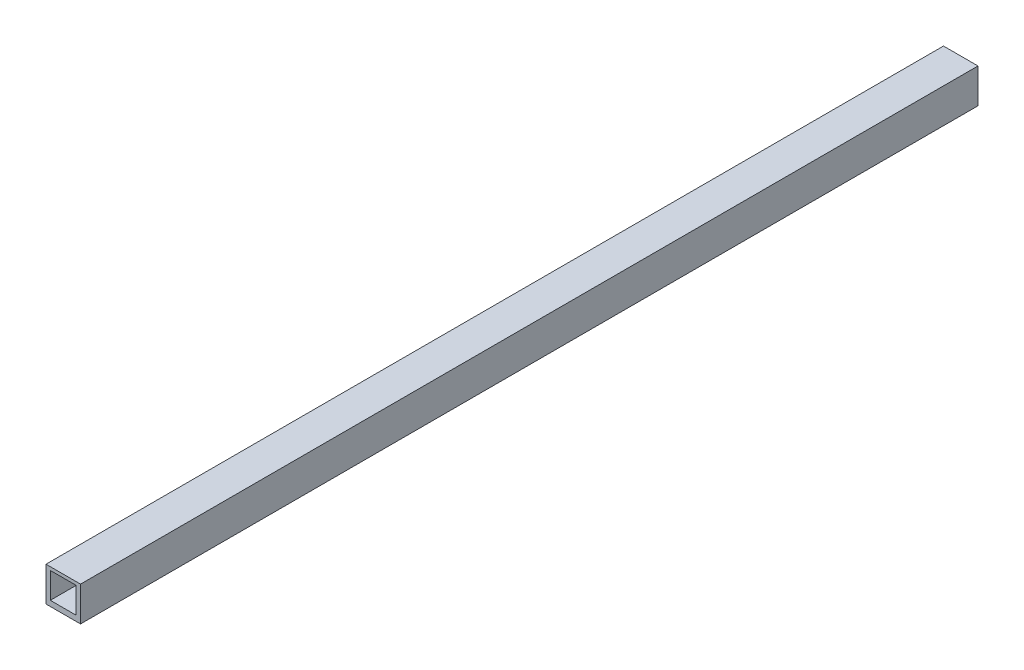
ISO-10303-21;
HEADER;
FILE_DESCRIPTION(('STEP AP214'),'2;1');
FILE_NAME('part.step','',(''),(''),'','','');
FILE_SCHEMA(('AUTOMOTIVE_DESIGN { 1 0 10303 214 1 1 1 1 }'));
ENDSEC;
DATA;
#1=APPLICATION_CONTEXT('core data for automotive mechanical design processes');
#2=APPLICATION_PROTOCOL_DEFINITION('international standard','automotive_design',2000,#1);
#3=PRODUCT_CONTEXT('',#1,'mechanical');
#4=PRODUCT('Part','Part','',(#3));
#5=PRODUCT_RELATED_PRODUCT_CATEGORY('part','',(#4));
#6=PRODUCT_DEFINITION_FORMATION('','',#4);
#7=PRODUCT_DEFINITION_CONTEXT('part definition',#1,'design');
#8=PRODUCT_DEFINITION('design','',#6,#7);
#9=PRODUCT_DEFINITION_SHAPE('','',#8);
#10=(LENGTH_UNIT() NAMED_UNIT(*) SI_UNIT(.MILLI.,.METRE.));
#11=(NAMED_UNIT(*) PLANE_ANGLE_UNIT() SI_UNIT($,.RADIAN.));
#12=(NAMED_UNIT(*) SI_UNIT($,.STERADIAN.) SOLID_ANGLE_UNIT());
#13=UNCERTAINTY_MEASURE_WITH_UNIT(LENGTH_MEASURE(1.E-05),#10,'distance_accuracy_value','');
#14=(GEOMETRIC_REPRESENTATION_CONTEXT(3) GLOBAL_UNCERTAINTY_ASSIGNED_CONTEXT((#13)) GLOBAL_UNIT_ASSIGNED_CONTEXT((#10,
#11,#12)) REPRESENTATION_CONTEXT('',''));
#15=CARTESIAN_POINT('',(0.,0.,0.));
#16=DIRECTION('',(0.,0.,1.));
#17=DIRECTION('',(1.,0.,0.));
#18=AXIS2_PLACEMENT_3D('',#15,#16,#17);
#19=CARTESIAN_POINT('',(12.7,-13.4892655367232,660.4));
#20=DIRECTION('',(-1.,0.,0.));
#21=DIRECTION('',(0.,0.,1.));
#22=AXIS2_PLACEMENT_3D('',#19,#20,#21);
#23=PLANE('',#22);
#24=DIRECTION('',(0.,1.,0.));
#25=VECTOR('',#24,1.);
#26=CARTESIAN_POINT('',(12.7,-13.4892655367232,0.));
#27=LINE('',#26,#25);
#28=CARTESIAN_POINT('',(12.7,-13.4892655367232,0.));
#29=VERTEX_POINT('',#28);
#30=CARTESIAN_POINT('',(12.7,11.9107344632768,0.));
#31=VERTEX_POINT('',#30);
#32=EDGE_CURVE('E156',#29,#31,#27,.T.);
#33=ORIENTED_EDGE('',*,*,#32,.T.);
#34=DIRECTION('',(0.,0.,-1.));
#35=VECTOR('',#34,1.);
#36=CARTESIAN_POINT('',(12.7,11.9107344632768,660.4));
#37=LINE('',#36,#35);
#38=CARTESIAN_POINT('',(12.7,11.9107344632768,660.4));
#39=VERTEX_POINT('',#38);
#40=EDGE_CURVE('E11',#39,#31,#37,.T.);
#41=ORIENTED_EDGE('',*,*,#40,.F.);
#42=DIRECTION('',(0.,1.,0.));
#43=VECTOR('',#42,1.);
#44=CARTESIAN_POINT('',(12.7,-13.4892655367232,660.4));
#45=LINE('',#44,#43);
#46=CARTESIAN_POINT('',(12.7,-13.4892655367232,660.4));
#47=VERTEX_POINT('',#46);
#48=EDGE_CURVE('E157',#47,#39,#45,.T.);
#49=ORIENTED_EDGE('',*,*,#48,.F.);
#50=DIRECTION('',(0.,0.,-1.));
#51=VECTOR('',#50,1.);
#52=CARTESIAN_POINT('',(12.7,-13.4892655367232,660.4));
#53=LINE('',#52,#51);
#54=EDGE_CURVE('E171',#47,#29,#53,.T.);
#55=ORIENTED_EDGE('',*,*,#54,.T.);
#56=EDGE_LOOP('',(#33,#41,#49,#55));
#57=FACE_BOUND('',#56,.T.);
#58=ADVANCED_FACE('F45',(#57),#23,.F.);
#59=CARTESIAN_POINT('',(-12.7,11.9107344632768,660.4));
#60=DIRECTION('',(0.,-1.,0.));
#61=DIRECTION('',(0.,0.,-1.));
#62=AXIS2_PLACEMENT_3D('',#59,#60,#61);
#63=PLANE('',#62);
#64=DIRECTION('',(-1.,0.,0.));
#65=VECTOR('',#64,1.);
#66=CARTESIAN_POINT('',(-12.7,11.9107344632768,0.));
#67=LINE('',#66,#65);
#68=CARTESIAN_POINT('',(-12.7,11.9107344632768,0.));
#69=VERTEX_POINT('',#68);
#70=EDGE_CURVE('E175',#31,#69,#67,.T.);
#71=ORIENTED_EDGE('',*,*,#70,.T.);
#72=DIRECTION('',(0.,0.,-1.));
#73=VECTOR('',#72,1.);
#74=CARTESIAN_POINT('',(-12.7,11.9107344632768,660.4));
#75=LINE('',#74,#73);
#76=CARTESIAN_POINT('',(-12.7,11.9107344632768,660.4));
#77=VERTEX_POINT('',#76);
#78=EDGE_CURVE('E53',#77,#69,#75,.T.);
#79=ORIENTED_EDGE('',*,*,#78,.F.);
#80=DIRECTION('',(-1.,0.,0.));
#81=VECTOR('',#80,1.);
#82=CARTESIAN_POINT('',(-12.7,11.9107344632768,660.4));
#83=LINE('',#82,#81);
#84=EDGE_CURVE('E161',#39,#77,#83,.T.);
#85=ORIENTED_EDGE('',*,*,#84,.F.);
#86=ORIENTED_EDGE('',*,*,#40,.T.);
#87=EDGE_LOOP('',(#71,#79,#85,#86));
#88=FACE_BOUND('',#87,.T.);
#89=ADVANCED_FACE('F209',(#88),#63,.F.);
#90=CARTESIAN_POINT('',(-12.7,-13.4892655367232,660.4));
#91=DIRECTION('',(1.,0.,0.));
#92=DIRECTION('',(0.,0.,-1.));
#93=AXIS2_PLACEMENT_3D('',#90,#91,#92);
#94=PLANE('',#93);
#95=DIRECTION('',(0.,-1.,0.));
#96=VECTOR('',#95,1.);
#97=CARTESIAN_POINT('',(-12.7,-13.4892655367232,0.));
#98=LINE('',#97,#96);
#99=CARTESIAN_POINT('',(-12.7,-13.4892655367232,0.));
#100=VERTEX_POINT('',#99);
#101=EDGE_CURVE('E178',#69,#100,#98,.T.);
#102=ORIENTED_EDGE('',*,*,#101,.T.);
#103=DIRECTION('',(0.,0.,-1.));
#104=VECTOR('',#103,1.);
#105=CARTESIAN_POINT('',(-12.7,-13.4892655367232,660.4));
#106=LINE('',#105,#104);
#107=CARTESIAN_POINT('',(-12.7,-13.4892655367232,660.4));
#108=VERTEX_POINT('',#107);
#109=EDGE_CURVE('E186',#108,#100,#106,.T.);
#110=ORIENTED_EDGE('',*,*,#109,.F.);
#111=DIRECTION('',(0.,-1.,0.));
#112=VECTOR('',#111,1.);
#113=CARTESIAN_POINT('',(-12.7,-13.4892655367232,660.4));
#114=LINE('',#113,#112);
#115=EDGE_CURVE('E165',#77,#108,#114,.T.);
#116=ORIENTED_EDGE('',*,*,#115,.F.);
#117=ORIENTED_EDGE('',*,*,#78,.T.);
#118=EDGE_LOOP('',(#102,#110,#116,#117));
#119=FACE_BOUND('',#118,.T.);
#120=ADVANCED_FACE('F195',(#119),#94,.F.);
#121=CARTESIAN_POINT('',(-12.7,-13.4892655367232,660.4));
#122=DIRECTION('',(0.,1.,0.));
#123=DIRECTION('',(0.,0.,1.));
#124=AXIS2_PLACEMENT_3D('',#121,#122,#123);
#125=PLANE('',#124);
#126=DIRECTION('',(1.,0.,0.));
#127=VECTOR('',#126,1.);
#128=CARTESIAN_POINT('',(-12.7,-13.4892655367232,0.));
#129=LINE('',#128,#127);
#130=EDGE_CURVE('E162',#100,#29,#129,.T.);
#131=ORIENTED_EDGE('',*,*,#130,.T.);
#132=ORIENTED_EDGE('',*,*,#54,.F.);
#133=DIRECTION('',(1.,0.,0.));
#134=VECTOR('',#133,1.);
#135=CARTESIAN_POINT('',(-12.7,-13.4892655367232,660.4));
#136=LINE('',#135,#134);
#137=EDGE_CURVE('E168',#108,#47,#136,.T.);
#138=ORIENTED_EDGE('',*,*,#137,.F.);
#139=ORIENTED_EDGE('',*,*,#109,.T.);
#140=EDGE_LOOP('',(#131,#132,#138,#139));
#141=FACE_BOUND('',#140,.T.);
#142=ADVANCED_FACE('F202',(#141),#125,.F.);
#143=CARTESIAN_POINT('',(0.,0.,660.4));
#144=DIRECTION('',(0.,0.,-1.));
#145=DIRECTION('',(-1.,0.,0.));
#146=AXIS2_PLACEMENT_3D('',#143,#144,#145);
#147=PLANE('',#146);
#148=DIRECTION('',(0.,-1.,0.));
#149=VECTOR('',#148,1.);
#150=CARTESIAN_POINT('',(-9.525,-9.525,660.4));
#151=LINE('',#150,#149);
#152=CARTESIAN_POINT('',(-9.525,9.525,660.4));
#153=VERTEX_POINT('',#152);
#154=CARTESIAN_POINT('',(-9.525,-9.525,660.4));
#155=VERTEX_POINT('',#154);
#156=EDGE_CURVE('E138',#153,#155,#151,.T.);
#157=ORIENTED_EDGE('',*,*,#156,.F.);
#158=DIRECTION('',(-1.,0.,0.));
#159=VECTOR('',#158,1.);
#160=CARTESIAN_POINT('',(-9.525,9.525,660.4));
#161=LINE('',#160,#159);
#162=CARTESIAN_POINT('',(9.525,9.525,660.4));
#163=VERTEX_POINT('',#162);
#164=EDGE_CURVE('E128',#163,#153,#161,.T.);
#165=ORIENTED_EDGE('',*,*,#164,.F.);
#166=DIRECTION('',(0.,1.,0.));
#167=VECTOR('',#166,1.);
#168=CARTESIAN_POINT('',(9.525,-9.525,660.4));
#169=LINE('',#168,#167);
#170=CARTESIAN_POINT('',(9.525,-9.525,660.4));
#171=VERTEX_POINT('',#170);
#172=EDGE_CURVE('E142',#171,#163,#169,.T.);
#173=ORIENTED_EDGE('',*,*,#172,.F.);
#174=DIRECTION('',(1.,0.,0.));
#175=VECTOR('',#174,1.);
#176=CARTESIAN_POINT('',(-9.525,-9.525,660.4));
#177=LINE('',#176,#175);
#178=EDGE_CURVE('E60',#155,#171,#177,.T.);
#179=ORIENTED_EDGE('',*,*,#178,.F.);
#180=EDGE_LOOP('',(#157,#165,#173,#179));
#181=FACE_BOUND('',#180,.T.);
#182=ORIENTED_EDGE('',*,*,#48,.T.);
#183=ORIENTED_EDGE('',*,*,#84,.T.);
#184=ORIENTED_EDGE('',*,*,#115,.T.);
#185=ORIENTED_EDGE('',*,*,#137,.T.);
#186=EDGE_LOOP('',(#182,#183,#184,#185));
#187=FACE_BOUND('',#186,.T.);
#188=ADVANCED_FACE('F208',(#181,#187),#147,.F.);
#189=CARTESIAN_POINT('',(0.,0.,0.));
#190=DIRECTION('',(0.,0.,-1.));
#191=DIRECTION('',(-1.,0.,0.));
#192=AXIS2_PLACEMENT_3D('',#189,#190,#191);
#193=PLANE('',#192);
#194=DIRECTION('',(-1.,0.,0.));
#195=VECTOR('',#194,1.);
#196=CARTESIAN_POINT('',(-9.525,9.525,0.));
#197=LINE('',#196,#195);
#198=CARTESIAN_POINT('',(9.525,9.525,0.));
#199=VERTEX_POINT('',#198);
#200=CARTESIAN_POINT('',(-9.525,9.525,0.));
#201=VERTEX_POINT('',#200);
#202=EDGE_CURVE('E125',#199,#201,#197,.T.);
#203=ORIENTED_EDGE('',*,*,#202,.T.);
#204=DIRECTION('',(0.,-1.,0.));
#205=VECTOR('',#204,1.);
#206=CARTESIAN_POINT('',(-9.525,-9.525,0.));
#207=LINE('',#206,#205);
#208=CARTESIAN_POINT('',(-9.525,-9.525,0.));
#209=VERTEX_POINT('',#208);
#210=EDGE_CURVE('E111',#201,#209,#207,.T.);
#211=ORIENTED_EDGE('',*,*,#210,.T.);
#212=DIRECTION('',(1.,0.,0.));
#213=VECTOR('',#212,1.);
#214=CARTESIAN_POINT('',(-9.525,-9.525,0.));
#215=LINE('',#214,#213);
#216=CARTESIAN_POINT('',(9.525,-9.525,0.));
#217=VERTEX_POINT('',#216);
#218=EDGE_CURVE('E147',#209,#217,#215,.T.);
#219=ORIENTED_EDGE('',*,*,#218,.T.);
#220=DIRECTION('',(0.,1.,0.));
#221=VECTOR('',#220,1.);
#222=CARTESIAN_POINT('',(9.525,-9.525,0.));
#223=LINE('',#222,#221);
#224=EDGE_CURVE('E134',#217,#199,#223,.T.);
#225=ORIENTED_EDGE('',*,*,#224,.T.);
#226=EDGE_LOOP('',(#203,#211,#219,#225));
#227=FACE_BOUND('',#226,.T.);
#228=ORIENTED_EDGE('',*,*,#32,.F.);
#229=ORIENTED_EDGE('',*,*,#130,.F.);
#230=ORIENTED_EDGE('',*,*,#101,.F.);
#231=ORIENTED_EDGE('',*,*,#70,.F.);
#232=EDGE_LOOP('',(#228,#229,#230,#231));
#233=FACE_BOUND('',#232,.T.);
#234=ADVANCED_FACE('F132',(#227,#233),#193,.T.);
#235=CARTESIAN_POINT('',(-9.525,9.525,-26.9407683632075));
#236=DIRECTION('',(0.,1.,0.));
#237=DIRECTION('',(0.,0.,1.));
#238=AXIS2_PLACEMENT_3D('',#235,#236,#237);
#239=PLANE('',#238);
#240=DIRECTION('',(0.,0.,1.));
#241=VECTOR('',#240,1.);
#242=CARTESIAN_POINT('',(9.525,9.525,-26.9407683632075));
#243=LINE('',#242,#241);
#244=EDGE_CURVE('E68',#199,#163,#243,.T.);
#245=ORIENTED_EDGE('',*,*,#244,.T.);
#246=ORIENTED_EDGE('',*,*,#164,.T.);
#247=DIRECTION('',(0.,0.,1.));
#248=VECTOR('',#247,1.);
#249=CARTESIAN_POINT('',(-9.525,9.525,-26.9407683632075));
#250=LINE('',#249,#248);
#251=EDGE_CURVE('E115',#201,#153,#250,.T.);
#252=ORIENTED_EDGE('',*,*,#251,.F.);
#253=ORIENTED_EDGE('',*,*,#202,.F.);
#254=EDGE_LOOP('',(#245,#246,#252,#253));
#255=FACE_BOUND('',#254,.T.);
#256=ADVANCED_FACE('F124',(#255),#239,.F.);
#257=CARTESIAN_POINT('',(-9.525,-9.525,-26.9407683632075));
#258=DIRECTION('',(-1.,0.,0.));
#259=DIRECTION('',(0.,0.,1.));
#260=AXIS2_PLACEMENT_3D('',#257,#258,#259);
#261=PLANE('',#260);
#262=ORIENTED_EDGE('',*,*,#251,.T.);
#263=ORIENTED_EDGE('',*,*,#156,.T.);
#264=DIRECTION('',(0.,0.,1.));
#265=VECTOR('',#264,1.);
#266=CARTESIAN_POINT('',(-9.525,-9.525,-26.9407683632075));
#267=LINE('',#266,#265);
#268=EDGE_CURVE('E117',#209,#155,#267,.T.);
#269=ORIENTED_EDGE('',*,*,#268,.F.);
#270=ORIENTED_EDGE('',*,*,#210,.F.);
#271=EDGE_LOOP('',(#262,#263,#269,#270));
#272=FACE_BOUND('',#271,.T.);
#273=ADVANCED_FACE('F113',(#272),#261,.F.);
#274=CARTESIAN_POINT('',(-9.525,-9.525,-26.9407683632075));
#275=DIRECTION('',(0.,-1.,0.));
#276=DIRECTION('',(0.,0.,-1.));
#277=AXIS2_PLACEMENT_3D('',#274,#275,#276);
#278=PLANE('',#277);
#279=ORIENTED_EDGE('',*,*,#268,.T.);
#280=ORIENTED_EDGE('',*,*,#178,.T.);
#281=DIRECTION('',(0.,0.,1.));
#282=VECTOR('',#281,1.);
#283=CARTESIAN_POINT('',(9.525,-9.525,-26.9407683632075));
#284=LINE('',#283,#282);
#285=EDGE_CURVE('E146',#217,#171,#284,.T.);
#286=ORIENTED_EDGE('',*,*,#285,.F.);
#287=ORIENTED_EDGE('',*,*,#218,.F.);
#288=EDGE_LOOP('',(#279,#280,#286,#287));
#289=FACE_BOUND('',#288,.T.);
#290=ADVANCED_FACE('F228',(#289),#278,.F.);
#291=CARTESIAN_POINT('',(9.525,-9.525,-26.9407683632075));
#292=DIRECTION('',(1.,0.,0.));
#293=DIRECTION('',(0.,0.,-1.));
#294=AXIS2_PLACEMENT_3D('',#291,#292,#293);
#295=PLANE('',#294);
#296=ORIENTED_EDGE('',*,*,#285,.T.);
#297=ORIENTED_EDGE('',*,*,#172,.T.);
#298=ORIENTED_EDGE('',*,*,#244,.F.);
#299=ORIENTED_EDGE('',*,*,#224,.F.);
#300=EDGE_LOOP('',(#296,#297,#298,#299));
#301=FACE_BOUND('',#300,.T.);
#302=ADVANCED_FACE('F231',(#301),#295,.F.);
#303=CLOSED_SHELL('',(#58,#89,#120,#142,#188,#234,#256,#273,#290,#302));
#304=MANIFOLD_SOLID_BREP('B2',#303);
#305=ADVANCED_BREP_SHAPE_REPRESENTATION('',(#18,#304),#14);
#306=SHAPE_DEFINITION_REPRESENTATION(#9,#305);
ENDSEC;
END-ISO-10303-21;
